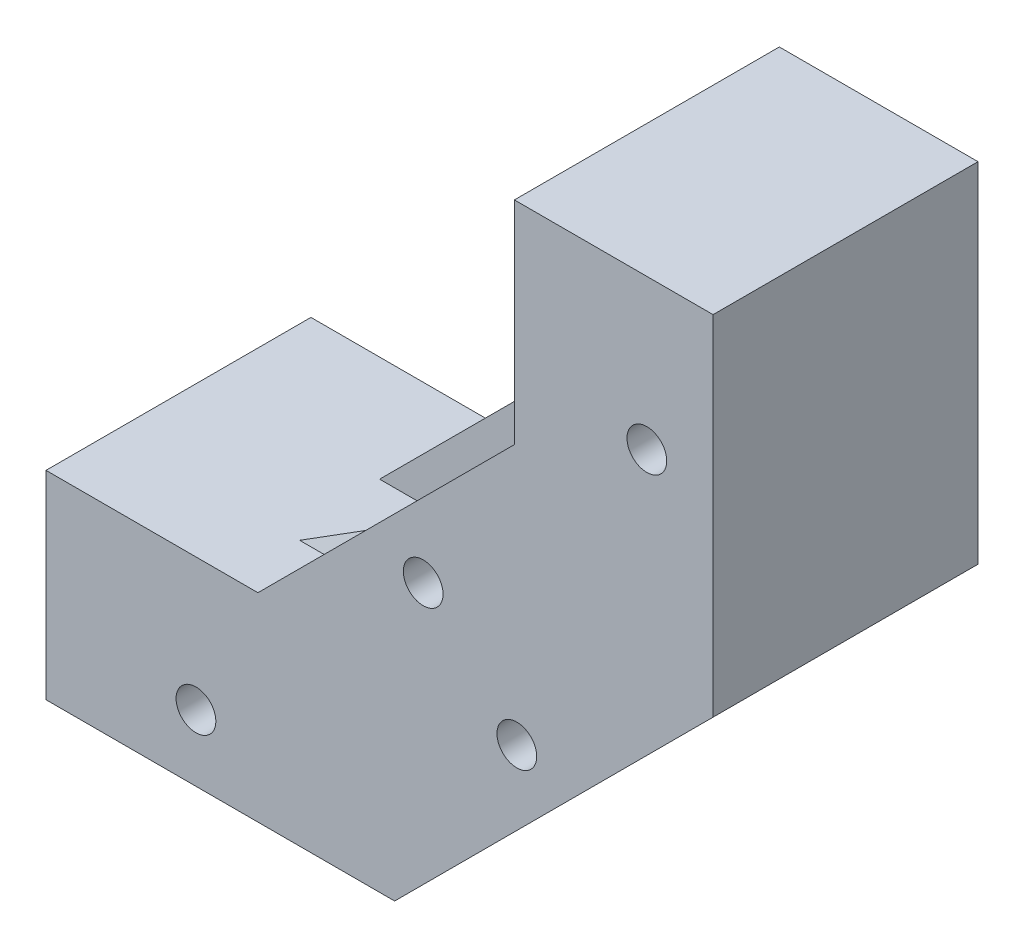
ISO-10303-21;
HEADER;
FILE_DESCRIPTION(('STEP AP214'),'2;1');
FILE_NAME('part.step','',(''),(''),'','','');
FILE_SCHEMA(('AUTOMOTIVE_DESIGN { 1 0 10303 214 1 1 1 1 }'));
ENDSEC;
DATA;
#1=APPLICATION_CONTEXT('core data for automotive mechanical design processes');
#2=APPLICATION_PROTOCOL_DEFINITION('international standard','automotive_design',2000,#1);
#3=PRODUCT_CONTEXT('',#1,'mechanical');
#4=PRODUCT('Part','Part','',(#3));
#5=PRODUCT_RELATED_PRODUCT_CATEGORY('part','',(#4));
#6=PRODUCT_DEFINITION_FORMATION('','',#4);
#7=PRODUCT_DEFINITION_CONTEXT('part definition',#1,'design');
#8=PRODUCT_DEFINITION('design','',#6,#7);
#9=PRODUCT_DEFINITION_SHAPE('','',#8);
#10=(LENGTH_UNIT() NAMED_UNIT(*) SI_UNIT(.MILLI.,.METRE.));
#11=(NAMED_UNIT(*) PLANE_ANGLE_UNIT() SI_UNIT($,.RADIAN.));
#12=(NAMED_UNIT(*) SI_UNIT($,.STERADIAN.) SOLID_ANGLE_UNIT());
#13=UNCERTAINTY_MEASURE_WITH_UNIT(LENGTH_MEASURE(1.E-05),#10,'distance_accuracy_value','');
#14=(GEOMETRIC_REPRESENTATION_CONTEXT(3) GLOBAL_UNCERTAINTY_ASSIGNED_CONTEXT((#13)) GLOBAL_UNIT_ASSIGNED_CONTEXT((#10,
#11,#12)) REPRESENTATION_CONTEXT('',''));
#15=CARTESIAN_POINT('',(0.,0.,0.));
#16=DIRECTION('',(0.,0.,1.));
#17=DIRECTION('',(1.,0.,0.));
#18=AXIS2_PLACEMENT_3D('',#15,#16,#17);
#19=CARTESIAN_POINT('',(114.678584629936,15.,0.));
#20=DIRECTION('',(-0.707106781186548,0.707106781186548,0.));
#21=DIRECTION('',(-0.707106781186548,-0.707106781186548,0.));
#22=AXIS2_PLACEMENT_3D('',#19,#20,#21);
#23=PLANE('',#22);
#24=DIRECTION('',(0.271964146610214,0.271964146610214,-0.923076923076921));
#25=VECTOR('',#24,1.);
#26=CARTESIAN_POINT('',(114.678584629936,15.,-8.13982140363869));
#27=LINE('',#26,#25);
#28=CARTESIAN_POINT('',(114.678584629936,15.,-8.1398214036387));
#29=VERTEX_POINT('',#28);
#30=CARTESIAN_POINT('',(115.820582400471,16.1419977705354,-12.0158903683372));
#31=VERTEX_POINT('',#30);
#32=EDGE_CURVE('E203',#29,#31,#27,.T.);
#33=ORIENTED_EDGE('',*,*,#32,.T.);
#34=DIRECTION('',(0.707106781186548,0.707106781186548,0.));
#35=VECTOR('',#34,1.);
#36=CARTESIAN_POINT('',(134.041630560343,34.3630459304069,-12.0158903683372));
#37=LINE('',#36,#35);
#38=CARTESIAN_POINT('',(114.678584629936,15.,-12.0158903683372));
#39=VERTEX_POINT('',#38);
#40=EDGE_CURVE('E474',#39,#31,#37,.T.);
#41=ORIENTED_EDGE('',*,*,#40,.F.);
#42=DIRECTION('',(0.,0.,1.));
#43=VECTOR('',#42,1.);
#44=CARTESIAN_POINT('',(114.678584629936,15.,0.));
#45=LINE('',#44,#43);
#46=EDGE_CURVE('E195',#39,#29,#45,.T.);
#47=ORIENTED_EDGE('',*,*,#46,.T.);
#48=EDGE_LOOP('',(#33,#41,#47));
#49=FACE_BOUND('',#48,.T.);
#50=ADVANCED_FACE('F41',(#49),#23,.T.);
#51=CARTESIAN_POINT('',(132.899632789807,33.2210481598714,-12.0158903683372));
#52=VERTEX_POINT('',#51);
#53=EDGE_CURVE('E473',#31,#52,#37,.T.);
#54=ORIENTED_EDGE('',*,*,#53,.F.);
#55=CARTESIAN_POINT('',(117.289039783274,17.6104551533379,-17.));
#56=VERTEX_POINT('',#55);
#57=EDGE_CURVE('E206',#31,#56,#27,.T.);
#58=ORIENTED_EDGE('',*,*,#57,.T.);
#59=DIRECTION('',(-0.707106781186548,-0.707106781186548,0.));
#60=VECTOR('',#59,1.);
#61=CARTESIAN_POINT('',(114.678584629936,15.,-17.));
#62=LINE('',#61,#60);
#63=CARTESIAN_POINT('',(131.431175407005,31.7525907770689,-17.));
#64=VERTEX_POINT('',#63);
#65=EDGE_CURVE('E200',#56,#64,#62,.F.);
#66=ORIENTED_EDGE('',*,*,#65,.T.);
#67=DIRECTION('',(0.271964146610213,0.271964146610212,0.923076923076922));
#68=VECTOR('',#67,1.);
#69=CARTESIAN_POINT('',(131.431175407005,31.7525907770689,-17.));
#70=LINE('',#69,#68);
#71=EDGE_CURVE('E197',#64,#52,#70,.T.);
#72=ORIENTED_EDGE('',*,*,#71,.T.);
#73=EDGE_LOOP('',(#54,#58,#66,#72));
#74=FACE_BOUND('',#73,.T.);
#75=ADVANCED_FACE('F526',(#74),#23,.F.);
#76=DIRECTION('',(0.,0.,1.));
#77=VECTOR('',#76,1.);
#78=CARTESIAN_POINT('',(134.041630560343,34.3630459304068,0.));
#79=LINE('',#78,#77);
#80=CARTESIAN_POINT('',(134.041630560343,34.363045930407,-12.0158903683372));
#81=VERTEX_POINT('',#80);
#82=CARTESIAN_POINT('',(134.041630560343,34.3630459304069,-8.13982140363858));
#83=VERTEX_POINT('',#82);
#84=EDGE_CURVE('E176',#81,#83,#79,.T.);
#85=ORIENTED_EDGE('',*,*,#84,.F.);
#86=EDGE_CURVE('E470',#52,#81,#37,.T.);
#87=ORIENTED_EDGE('',*,*,#86,.F.);
#88=EDGE_CURVE('E199',#52,#83,#70,.T.);
#89=ORIENTED_EDGE('',*,*,#88,.T.);
#90=EDGE_LOOP('',(#85,#87,#89));
#91=FACE_BOUND('',#90,.T.);
#92=ADVANCED_FACE('F523',(#91),#23,.T.);
#93=CARTESIAN_POINT('',(119.410360126833,19.7317754968976,-2.50000000000008));
#94=DIRECTION('',(0.707106781186547,-0.707106781186548,0.));
#95=DIRECTION('',(0.707106781186548,0.707106781186547,0.));
#96=AXIS2_PLACEMENT_3D('',#93,#94,#95);
#97=CYLINDRICAL_SURFACE('',#96,0.999999999999996);
#98=CARTESIAN_POINT('',(131.717514421272,7.42462120245879,-2.50000000000008));
#99=DIRECTION('',(-0.707106781186548,0.707106781186547,0.));
#100=DIRECTION('',(0.,0.,1.));
#101=AXIS2_PLACEMENT_3D('',#98,#99,#100);
#102=CIRCLE('',#101,1.);
#103=CARTESIAN_POINT('',(131.717514421272,7.42462120245879,-1.50000000000008));
#104=VERTEX_POINT('',#103);
#105=EDGE_CURVE('E367',#104,#104,#102,.T.);
#106=ORIENTED_EDGE('',*,*,#105,.F.);
#107=EDGE_LOOP('',(#106));
#108=FACE_BOUND('',#107,.T.);
#109=CARTESIAN_POINT('',(119.763913517427,19.3782221063045,-2.50000000000008));
#110=DIRECTION('',(0.707106781186548,-0.707106781186548,0.));
#111=DIRECTION('',(0.,0.,-1.));
#112=AXIS2_PLACEMENT_3D('',#109,#110,#111);
#113=CIRCLE('',#112,1.);
#114=CARTESIAN_POINT('',(119.763913517427,19.3782221063045,-3.50000000000008));
#115=VERTEX_POINT('',#114);
#116=EDGE_CURVE('E407',#115,#115,#113,.T.);
#117=ORIENTED_EDGE('',*,*,#116,.F.);
#118=EDGE_LOOP('',(#117));
#119=FACE_BOUND('',#118,.T.);
#120=ADVANCED_FACE('F525',(#108,#119),#97,.F.);
#121=CARTESIAN_POINT('',(129.309855063445,29.6312704335092,-2.49999999999992));
#122=DIRECTION('',(0.707106781186547,-0.707106781186548,0.));
#123=DIRECTION('',(0.707106781186548,0.707106781186547,0.));
#124=AXIS2_PLACEMENT_3D('',#121,#122,#123);
#125=CYLINDRICAL_SURFACE('',#124,1.00000000000001);
#126=CARTESIAN_POINT('',(141.617009357884,17.3241161390704,-2.49999999999992));
#127=DIRECTION('',(-0.707106781186548,0.707106781186547,0.));
#128=DIRECTION('',(0.,0.,1.));
#129=AXIS2_PLACEMENT_3D('',#126,#127,#128);
#130=CIRCLE('',#129,1.00000000000001);
#131=CARTESIAN_POINT('',(141.617009357884,17.3241161390704,-1.49999999999991));
#132=VERTEX_POINT('',#131);
#133=EDGE_CURVE('E341',#132,#132,#130,.T.);
#134=ORIENTED_EDGE('',*,*,#133,.F.);
#135=EDGE_LOOP('',(#134));
#136=FACE_BOUND('',#135,.T.);
#137=CARTESIAN_POINT('',(129.663408454038,29.2777170429157,-2.49999999999992));
#138=DIRECTION('',(0.707106781186548,-0.707106781186548,0.));
#139=DIRECTION('',(0.,0.,-1.));
#140=AXIS2_PLACEMENT_3D('',#137,#138,#139);
#141=CIRCLE('',#140,1.00000000000001);
#142=CARTESIAN_POINT('',(129.663408454038,29.2777170429157,-3.49999999999993));
#143=VERTEX_POINT('',#142);
#144=EDGE_CURVE('E370',#143,#143,#141,.T.);
#145=ORIENTED_EDGE('',*,*,#144,.F.);
#146=EDGE_LOOP('',(#145));
#147=FACE_BOUND('',#146,.T.);
#148=ADVANCED_FACE('F533',(#136,#147),#125,.F.);
#149=CARTESIAN_POINT('',(119.763913517427,19.3782221063043,-2.50000000000008));
#150=DIRECTION('',(0.707106781186548,-0.707106781186548,0.));
#151=DIRECTION('',(0.,0.,-1.));
#152=AXIS2_PLACEMENT_3D('',#149,#150,#151);
#153=TOROIDAL_SURFACE('',#152,1.5,0.5);
#154=ORIENTED_EDGE('',*,*,#116,.T.);
#155=EDGE_LOOP('',(#154));
#156=FACE_BOUND('',#155,.T.);
#157=CARTESIAN_POINT('',(119.410360126834,19.7317754968976,-2.50000000000008));
#158=DIRECTION('',(-0.707106781186548,0.707106781186548,0.));
#159=DIRECTION('',(-2.31296463463576E-13,-2.31296463463576E-13,1.));
#160=AXIS2_PLACEMENT_3D('',#157,#158,#159);
#161=CIRCLE('',#160,1.49999999999999);
#162=CARTESIAN_POINT('',(119.410360126833,19.7317754968972,-1.00000000000009));
#163=VERTEX_POINT('',#162);
#164=EDGE_CURVE('E304',#163,#163,#161,.F.);
#165=ORIENTED_EDGE('',*,*,#164,.F.);
#166=EDGE_LOOP('',(#165));
#167=FACE_BOUND('',#166,.T.);
#168=ADVANCED_FACE('F391',(#156,#167),#153,.T.);
#169=CARTESIAN_POINT('',(129.663408454038,29.2777170429159,-2.49999999999992));
#170=DIRECTION('',(0.707106781186548,-0.707106781186548,0.));
#171=DIRECTION('',(0.,0.,-1.));
#172=AXIS2_PLACEMENT_3D('',#169,#170,#171);
#173=TOROIDAL_SURFACE('',#172,1.50000000000001,0.5);
#174=ORIENTED_EDGE('',*,*,#144,.T.);
#175=EDGE_LOOP('',(#174));
#176=FACE_BOUND('',#175,.T.);
#177=CARTESIAN_POINT('',(129.309855063445,29.6312704335092,-2.49999999999992));
#178=DIRECTION('',(-0.707106781186548,0.707106781186548,0.));
#179=DIRECTION('',(1.11022302462514E-13,1.08709337827879E-13,1.));
#180=AXIS2_PLACEMENT_3D('',#177,#178,#179);
#181=CIRCLE('',#180,1.50000000000002);
#182=CARTESIAN_POINT('',(129.309855063445,29.6312704335093,-0.999999999999903));
#183=VERTEX_POINT('',#182);
#184=EDGE_CURVE('E299',#183,#183,#181,.F.);
#185=ORIENTED_EDGE('',*,*,#184,.F.);
#186=EDGE_LOOP('',(#185));
#187=FACE_BOUND('',#186,.T.);
#188=ADVANCED_FACE('F385',(#176,#187),#173,.T.);
#189=CARTESIAN_POINT('',(134.225995343588,14.8156352167546,0.));
#190=DIRECTION('',(0.,0.,-1.));
#191=DIRECTION('',(-1.,0.,0.));
#192=AXIS2_PLACEMENT_3D('',#189,#190,#191);
#193=CYLINDRICAL_SURFACE('',#192,1.5);
#194=CARTESIAN_POINT('',(134.225995343588,14.8156352167546,-5.));
#195=DIRECTION('',(0.,0.,-1.));
#196=DIRECTION('',(-1.,0.,0.));
#197=AXIS2_PLACEMENT_3D('',#194,#195,#196);
#198=CIRCLE('',#197,1.5);
#199=CARTESIAN_POINT('',(132.725995343588,14.8156352167546,-5.));
#200=VERTEX_POINT('',#199);
#201=EDGE_CURVE('E340',#200,#200,#198,.T.);
#202=ORIENTED_EDGE('',*,*,#201,.T.);
#203=EDGE_LOOP('',(#202));
#204=FACE_BOUND('',#203,.T.);
#205=CARTESIAN_POINT('',(134.225995343588,14.8156352167546,0.));
#206=DIRECTION('',(0.,0.,-1.));
#207=DIRECTION('',(-1.,0.,0.));
#208=AXIS2_PLACEMENT_3D('',#205,#206,#207);
#209=CIRCLE('',#208,1.5);
#210=CARTESIAN_POINT('',(132.725995343588,14.8156352167546,0.));
#211=VERTEX_POINT('',#210);
#212=EDGE_CURVE('E291',#211,#211,#209,.F.);
#213=ORIENTED_EDGE('',*,*,#212,.T.);
#214=EDGE_LOOP('',(#213));
#215=FACE_BOUND('',#214,.T.);
#216=ADVANCED_FACE('F390',(#204,#215),#193,.F.);
#217=CARTESIAN_POINT('',(127.154927531723,21.8867030286201,0.));
#218=DIRECTION('',(0.,0.,-1.));
#219=DIRECTION('',(-1.,0.,0.));
#220=AXIS2_PLACEMENT_3D('',#217,#218,#219);
#221=CYLINDRICAL_SURFACE('',#220,1.5);
#222=CARTESIAN_POINT('',(127.154927531723,21.8867030286201,-5.));
#223=DIRECTION('',(0.,0.,-1.));
#224=DIRECTION('',(-1.,0.,0.));
#225=AXIS2_PLACEMENT_3D('',#222,#223,#224);
#226=CIRCLE('',#225,1.5);
#227=CARTESIAN_POINT('',(125.654927531723,21.8867030286201,-5.));
#228=VERTEX_POINT('',#227);
#229=EDGE_CURVE('E337',#228,#228,#226,.T.);
#230=ORIENTED_EDGE('',*,*,#229,.T.);
#231=EDGE_LOOP('',(#230));
#232=FACE_BOUND('',#231,.T.);
#233=CARTESIAN_POINT('',(127.154927531723,21.8867030286201,0.));
#234=DIRECTION('',(0.,0.,-1.));
#235=DIRECTION('',(-1.,0.,0.));
#236=AXIS2_PLACEMENT_3D('',#233,#234,#235);
#237=CIRCLE('',#236,1.5);
#238=CARTESIAN_POINT('',(125.654927531723,21.8867030286201,0.));
#239=VERTEX_POINT('',#238);
#240=EDGE_CURVE('E288',#239,#239,#237,.F.);
#241=ORIENTED_EDGE('',*,*,#240,.T.);
#242=EDGE_LOOP('',(#241));
#243=FACE_BOUND('',#242,.T.);
#244=ADVANCED_FACE('F636',(#232,#243),#221,.F.);
#245=CARTESIAN_POINT('',(131.717514421272,7.42462120245879,-2.50000000000008));
#246=DIRECTION('',(-0.707106781186548,0.707106781186547,0.));
#247=DIRECTION('',(0.,0.,1.));
#248=AXIS2_PLACEMENT_3D('',#245,#246,#247);
#249=TOROIDAL_SURFACE('',#248,1.5,0.5);
#250=ORIENTED_EDGE('',*,*,#105,.T.);
#251=EDGE_LOOP('',(#250));
#252=FACE_BOUND('',#251,.T.);
#253=CARTESIAN_POINT('',(132.071067811865,7.07106781186551,-2.50000000000008));
#254=DIRECTION('',(0.707106781186548,-0.707106781186547,0.));
#255=DIRECTION('',(2.22044604925031E-13,2.24357569559667E-13,-1.));
#256=AXIS2_PLACEMENT_3D('',#253,#254,#255);
#257=CIRCLE('',#256,1.5);
#258=CARTESIAN_POINT('',(132.071067811866,7.07106781186584,-4.00000000000008));
#259=VERTEX_POINT('',#258);
#260=EDGE_CURVE('E238',#259,#259,#257,.F.);
#261=ORIENTED_EDGE('',*,*,#260,.F.);
#262=EDGE_LOOP('',(#261));
#263=FACE_BOUND('',#262,.T.);
#264=ADVANCED_FACE('F351',(#252,#263),#249,.T.);
#265=CARTESIAN_POINT('',(141.617009357884,17.3241161390704,-2.49999999999992));
#266=DIRECTION('',(-0.707106781186548,0.707106781186547,0.));
#267=DIRECTION('',(0.,0.,1.));
#268=AXIS2_PLACEMENT_3D('',#265,#266,#267);
#269=TOROIDAL_SURFACE('',#268,1.50000000000001,0.5);
#270=ORIENTED_EDGE('',*,*,#133,.T.);
#271=EDGE_LOOP('',(#270));
#272=FACE_BOUND('',#271,.T.);
#273=CARTESIAN_POINT('',(141.970562748477,16.9705627484771,-2.49999999999992));
#274=DIRECTION('',(0.707106781186548,-0.707106781186547,0.));
#275=DIRECTION('',(0.,0.,-1.));
#276=AXIS2_PLACEMENT_3D('',#273,#274,#275);
#277=CIRCLE('',#276,1.50000000000001);
#278=CARTESIAN_POINT('',(141.970562748477,16.970562748477,-3.99999999999993));
#279=VERTEX_POINT('',#278);
#280=EDGE_CURVE('E233',#279,#279,#277,.F.);
#281=ORIENTED_EDGE('',*,*,#280,.F.);
#282=EDGE_LOOP('',(#281));
#283=FACE_BOUND('',#282,.T.);
#284=ADVANCED_FACE('F346',(#272,#283),#269,.T.);
#285=CARTESIAN_POINT('',(129.949747468306,4.94974746830585,-17.));
#286=DIRECTION('',(-0.652713951864506,-0.652713951864505,-0.384615384615385));
#287=DIRECTION('',(0.707106781186547,-0.707106781186548,0.));
#288=AXIS2_PLACEMENT_3D('',#285,#286,#287);
#289=PLANE('',#288);
#290=DIRECTION('',(0.70710678118655,-0.707106781186545,0.));
#291=VECTOR('',#290,1.);
#292=CARTESIAN_POINT('',(112.828427124746,15.,-4.99999999999997));
#293=LINE('',#292,#291);
#294=CARTESIAN_POINT('',(112.828427124746,15.0000000000001,-4.99999999999995));
#295=VERTEX_POINT('',#294);
#296=CARTESIAN_POINT('',(126.414213562373,1.41421356237303,-4.99999999999996));
#297=VERTEX_POINT('',#296);
#298=EDGE_CURVE('E338',#295,#297,#293,.T.);
#299=ORIENTED_EDGE('',*,*,#298,.T.);
#300=DIRECTION('',(-0.271964146610217,-0.271964146610218,0.923076923076919));
#301=VECTOR('',#300,1.);
#302=CARTESIAN_POINT('',(129.949747468306,4.9497474683057,-17.));
#303=LINE('',#302,#301);
#304=CARTESIAN_POINT('',(129.949747468306,4.94974746830581,-17.));
#305=VERTEX_POINT('',#304);
#306=EDGE_CURVE('E278',#305,#297,#303,.T.);
#307=ORIENTED_EDGE('',*,*,#306,.F.);
#308=DIRECTION('',(-0.707106781186545,0.70710678118655,0.));
#309=VECTOR('',#308,1.);
#310=CARTESIAN_POINT('',(129.949747468306,4.94974746830585,-17.));
#311=LINE('',#310,#309);
#312=EDGE_CURVE('E292',#305,#56,#311,.T.);
#313=ORIENTED_EDGE('',*,*,#312,.T.);
#314=ORIENTED_EDGE('',*,*,#57,.F.);
#315=ORIENTED_EDGE('',*,*,#32,.F.);
#316=DIRECTION('',(0.507673082566878,0.,-0.861549790341245));
#317=VECTOR('',#316,1.);
#318=CARTESIAN_POINT('',(112.828427124746,15.,-4.99999999999997));
#319=LINE('',#318,#317);
#320=EDGE_CURVE('E219',#295,#29,#319,.T.);
#321=ORIENTED_EDGE('',*,*,#320,.F.);
#322=EDGE_LOOP('',(#299,#307,#313,#314,#315,#321));
#323=FACE_BOUND('',#322,.T.);
#324=ADVANCED_FACE('F350',(#323),#289,.F.);
#325=CARTESIAN_POINT('',(126.414213562373,1.4142135623731,-5.));
#326=DIRECTION('',(0.,0.,1.));
#327=DIRECTION('',(1.,0.,0.));
#328=AXIS2_PLACEMENT_3D('',#325,#326,#327);
#329=PLANE('',#328);
#330=ORIENTED_EDGE('',*,*,#229,.F.);
#331=EDGE_LOOP('',(#330));
#332=FACE_BOUND('',#331,.T.);
#333=ORIENTED_EDGE('',*,*,#201,.F.);
#334=EDGE_LOOP('',(#333));
#335=FACE_BOUND('',#334,.T.);
#336=DIRECTION('',(-0.707106781186548,-0.707106781186548,0.));
#337=VECTOR('',#336,1.);
#338=CARTESIAN_POINT('',(114.678584629936,15.,-4.99999999999998));
#339=LINE('',#338,#337);
#340=CARTESIAN_POINT('',(134.041630560343,34.3630459304068,-4.99999999999998));
#341=VERTEX_POINT('',#340);
#342=CARTESIAN_POINT('',(114.678584629936,15.,-4.99999999999998));
#343=VERTEX_POINT('',#342);
#344=EDGE_CURVE('E330',#341,#343,#339,.T.);
#345=ORIENTED_EDGE('',*,*,#344,.F.);
#346=DIRECTION('',(0.,-1.,0.));
#347=VECTOR('',#346,1.);
#348=CARTESIAN_POINT('',(134.041630560343,34.3630459304068,-4.99999999999997));
#349=LINE('',#348,#347);
#350=CARTESIAN_POINT('',(134.041630560343,36.2132034355964,-4.99999999999998));
#351=VERTEX_POINT('',#350);
#352=EDGE_CURVE('E193',#351,#341,#349,.T.);
#353=ORIENTED_EDGE('',*,*,#352,.F.);
#354=DIRECTION('',(-0.707106781186548,0.707106781186547,0.));
#355=VECTOR('',#354,1.);
#356=CARTESIAN_POINT('',(147.62741699797,22.6274169979695,-4.99999999999999));
#357=LINE('',#356,#355);
#358=CARTESIAN_POINT('',(147.62741699797,22.6274169979695,-5.));
#359=VERTEX_POINT('',#358);
#360=EDGE_CURVE('E297',#351,#359,#357,.F.);
#361=ORIENTED_EDGE('',*,*,#360,.T.);
#362=DIRECTION('',(0.707106781186547,0.707106781186548,0.));
#363=VECTOR('',#362,1.);
#364=CARTESIAN_POINT('',(149.041630560343,24.0416305603426,-4.99999999999999));
#365=LINE('',#364,#363);
#366=EDGE_CURVE('E275',#297,#359,#365,.T.);
#367=ORIENTED_EDGE('',*,*,#366,.F.);
#368=ORIENTED_EDGE('',*,*,#298,.F.);
#369=DIRECTION('',(-1.,0.,0.));
#370=VECTOR('',#369,1.);
#371=CARTESIAN_POINT('',(98.6785846299358,15.,-4.99999999999997));
#372=LINE('',#371,#370);
#373=EDGE_CURVE('E207',#343,#295,#372,.T.);
#374=ORIENTED_EDGE('',*,*,#373,.F.);
#375=EDGE_LOOP('',(#345,#353,#361,#367,#368,#374));
#376=FACE_BOUND('',#375,.T.);
#377=ADVANCED_FACE('F322',(#332,#335,#376),#329,.F.);
#378=CARTESIAN_POINT('',(114.678584629936,15.,0.));
#379=DIRECTION('',(-0.707106781186548,0.707106781186548,0.));
#380=DIRECTION('',(-0.707106781186548,-0.707106781186548,0.));
#381=AXIS2_PLACEMENT_3D('',#378,#379,#380);
#382=PLANE('',#381);
#383=ORIENTED_EDGE('',*,*,#184,.T.);
#384=EDGE_LOOP('',(#383));
#385=FACE_BOUND('',#384,.T.);
#386=ORIENTED_EDGE('',*,*,#164,.T.);
#387=EDGE_LOOP('',(#386));
#388=FACE_BOUND('',#387,.T.);
#389=DIRECTION('',(0.707106781186551,0.707106781186544,0.));
#390=VECTOR('',#389,1.);
#391=CARTESIAN_POINT('',(114.678584629936,15.,0.));
#392=LINE('',#391,#390);
#393=CARTESIAN_POINT('',(114.678584629936,15.,0.));
#394=VERTEX_POINT('',#393);
#395=CARTESIAN_POINT('',(134.041630560343,34.3630459304068,0.));
#396=VERTEX_POINT('',#395);
#397=EDGE_CURVE('E289',#394,#396,#392,.T.);
#398=ORIENTED_EDGE('',*,*,#397,.T.);
#399=DIRECTION('',(0.,0.,1.));
#400=VECTOR('',#399,1.);
#401=CARTESIAN_POINT('',(134.041630560343,34.3630459304068,0.));
#402=LINE('',#401,#400);
#403=EDGE_CURVE('E175',#341,#396,#402,.T.);
#404=ORIENTED_EDGE('',*,*,#403,.F.);
#405=ORIENTED_EDGE('',*,*,#344,.T.);
#406=DIRECTION('',(0.,0.,1.));
#407=VECTOR('',#406,1.);
#408=CARTESIAN_POINT('',(114.678584629936,15.,0.));
#409=LINE('',#408,#407);
#410=EDGE_CURVE('E210',#394,#343,#409,.F.);
#411=ORIENTED_EDGE('',*,*,#410,.F.);
#412=EDGE_LOOP('',(#398,#404,#405,#411));
#413=FACE_BOUND('',#412,.T.);
#414=ADVANCED_FACE('F311',(#385,#388,#413),#382,.T.);
#415=CARTESIAN_POINT('',(147.62741699797,22.6274169979695,-5.));
#416=DIRECTION('',(0.652713951864505,0.652713951864506,-0.384615384615385));
#417=DIRECTION('',(-0.707106781186548,0.707106781186547,0.));
#418=AXIS2_PLACEMENT_3D('',#415,#416,#417);
#419=PLANE('',#418);
#420=DIRECTION('',(0.707106781186544,-0.70710678118655,0.));
#421=VECTOR('',#420,1.);
#422=CARTESIAN_POINT('',(131.431175407005,31.7525907770689,-17.));
#423=LINE('',#422,#421);
#424=CARTESIAN_POINT('',(144.091883092037,19.0918830920367,-17.));
#425=VERTEX_POINT('',#424);
#426=EDGE_CURVE('E295',#64,#425,#423,.T.);
#427=ORIENTED_EDGE('',*,*,#426,.T.);
#428=DIRECTION('',(-0.271964146610217,-0.271964146610218,-0.923076923076919));
#429=VECTOR('',#428,1.);
#430=CARTESIAN_POINT('',(147.62741699797,22.6274169979695,-5.));
#431=LINE('',#430,#429);
#432=EDGE_CURVE('E272',#359,#425,#431,.T.);
#433=ORIENTED_EDGE('',*,*,#432,.F.);
#434=ORIENTED_EDGE('',*,*,#360,.F.);
#435=DIRECTION('',(0.,0.507673082566804,0.861549790341289));
#436=VECTOR('',#435,1.);
#437=CARTESIAN_POINT('',(134.041630560343,34.3630459304068,-8.13982140363861));
#438=LINE('',#437,#436);
#439=EDGE_CURVE('E168',#83,#351,#438,.T.);
#440=ORIENTED_EDGE('',*,*,#439,.F.);
#441=ORIENTED_EDGE('',*,*,#88,.F.);
#442=ORIENTED_EDGE('',*,*,#71,.F.);
#443=EDGE_LOOP('',(#427,#433,#434,#440,#441,#442));
#444=FACE_BOUND('',#443,.T.);
#445=ADVANCED_FACE('F321',(#444),#419,.F.);
#446=CARTESIAN_POINT('',(144.091883092037,19.0918830920368,-17.));
#447=DIRECTION('',(0.,0.,-1.));
#448=DIRECTION('',(-1.,0.,0.));
#449=AXIS2_PLACEMENT_3D('',#446,#447,#448);
#450=PLANE('',#449);
#451=CARTESIAN_POINT('',(127.154927531723,21.8867030286201,-17.));
#452=DIRECTION('',(0.,0.,-1.));
#453=DIRECTION('',(-1.,0.,0.));
#454=AXIS2_PLACEMENT_3D('',#451,#452,#453);
#455=CIRCLE('',#454,1.5);
#456=CARTESIAN_POINT('',(125.654927531723,21.8867030286201,-17.));
#457=VERTEX_POINT('',#456);
#458=EDGE_CURVE('E184',#457,#457,#455,.T.);
#459=ORIENTED_EDGE('',*,*,#458,.T.);
#460=EDGE_LOOP('',(#459));
#461=FACE_BOUND('',#460,.T.);
#462=CARTESIAN_POINT('',(134.225995343588,14.8156352167546,-17.));
#463=DIRECTION('',(0.,0.,-1.));
#464=DIRECTION('',(-1.,0.,0.));
#465=AXIS2_PLACEMENT_3D('',#462,#463,#464);
#466=CIRCLE('',#465,1.5);
#467=CARTESIAN_POINT('',(132.725995343588,14.8156352167546,-17.));
#468=VERTEX_POINT('',#467);
#469=EDGE_CURVE('E181',#468,#468,#466,.T.);
#470=ORIENTED_EDGE('',*,*,#469,.T.);
#471=EDGE_LOOP('',(#470));
#472=FACE_BOUND('',#471,.T.);
#473=ORIENTED_EDGE('',*,*,#312,.F.);
#474=DIRECTION('',(0.707106781186547,0.707106781186548,0.));
#475=VECTOR('',#474,1.);
#476=CARTESIAN_POINT('',(149.041630560343,24.0416305603426,-17.));
#477=LINE('',#476,#475);
#478=EDGE_CURVE('E264',#425,#305,#477,.F.);
#479=ORIENTED_EDGE('',*,*,#478,.F.);
#480=ORIENTED_EDGE('',*,*,#426,.F.);
#481=ORIENTED_EDGE('',*,*,#65,.F.);
#482=EDGE_LOOP('',(#473,#479,#480,#481));
#483=FACE_BOUND('',#482,.T.);
#484=ADVANCED_FACE('F621',(#461,#472,#483),#450,.F.);
#485=CARTESIAN_POINT('',(123.860107595139,25.1815229652034,0.));
#486=DIRECTION('',(0.,0.,-1.));
#487=DIRECTION('',(-1.,0.,0.));
#488=AXIS2_PLACEMENT_3D('',#485,#486,#487);
#489=PLANE('',#488);
#490=CARTESIAN_POINT('',(109.999999776483,5.00000007450576,0.));
#491=DIRECTION('',(0.,0.,-1.));
#492=DIRECTION('',(-1.,0.,0.));
#493=AXIS2_PLACEMENT_3D('',#490,#491,#492);
#494=CIRCLE('',#493,1.5);
#495=CARTESIAN_POINT('',(108.499999776483,5.00000007450576,0.));
#496=VERTEX_POINT('',#495);
#497=EDGE_CURVE('E416',#496,#496,#494,.T.);
#498=ORIENTED_EDGE('',*,*,#497,.T.);
#499=EDGE_LOOP('',(#498));
#500=FACE_BOUND('',#499,.T.);
#501=CARTESIAN_POINT('',(144.041630485837,39.0416307838601,0.));
#502=DIRECTION('',(0.,0.,-1.));
#503=DIRECTION('',(-1.,0.,0.));
#504=AXIS2_PLACEMENT_3D('',#501,#502,#503);
#505=CIRCLE('',#504,1.5);
#506=CARTESIAN_POINT('',(142.541630485837,39.0416307838601,0.));
#507=VERTEX_POINT('',#506);
#508=EDGE_CURVE('E425',#507,#507,#505,.T.);
#509=ORIENTED_EDGE('',*,*,#508,.T.);
#510=EDGE_LOOP('',(#509));
#511=FACE_BOUND('',#510,.T.);
#512=ORIENTED_EDGE('',*,*,#240,.F.);
#513=EDGE_LOOP('',(#512));
#514=FACE_BOUND('',#513,.T.);
#515=ORIENTED_EDGE('',*,*,#212,.F.);
#516=EDGE_LOOP('',(#515));
#517=FACE_BOUND('',#516,.T.);
#518=DIRECTION('',(-1.,0.,0.));
#519=VECTOR('',#518,1.);
#520=CARTESIAN_POINT('',(134.041630560343,50.3630459304068,0.));
#521=LINE('',#520,#519);
#522=CARTESIAN_POINT('',(134.041630560343,50.3630459304068,0.));
#523=VERTEX_POINT('',#522);
#524=CARTESIAN_POINT('',(149.041630560343,50.3630459304068,0.));
#525=VERTEX_POINT('',#524);
#526=EDGE_CURVE('E156',#523,#525,#521,.F.);
#527=ORIENTED_EDGE('',*,*,#526,.F.);
#528=DIRECTION('',(0.,-1.,0.));
#529=VECTOR('',#528,1.);
#530=CARTESIAN_POINT('',(134.041630560343,34.3630459304068,0.));
#531=LINE('',#530,#529);
#532=EDGE_CURVE('E159',#396,#523,#531,.F.);
#533=ORIENTED_EDGE('',*,*,#532,.F.);
#534=ORIENTED_EDGE('',*,*,#397,.F.);
#535=DIRECTION('',(-1.,0.,0.));
#536=VECTOR('',#535,1.);
#537=CARTESIAN_POINT('',(98.6785846299358,15.,0.));
#538=LINE('',#537,#536);
#539=CARTESIAN_POINT('',(98.6785846299358,15.,0.));
#540=VERTEX_POINT('',#539);
#541=EDGE_CURVE('E213',#540,#394,#538,.F.);
#542=ORIENTED_EDGE('',*,*,#541,.F.);
#543=DIRECTION('',(0.,-1.,0.));
#544=VECTOR('',#543,1.);
#545=CARTESIAN_POINT('',(98.6785846299358,0.,0.));
#546=LINE('',#545,#544);
#547=CARTESIAN_POINT('',(98.6785846299358,0.,0.));
#548=VERTEX_POINT('',#547);
#549=EDGE_CURVE('E225',#548,#540,#546,.F.);
#550=ORIENTED_EDGE('',*,*,#549,.F.);
#551=DIRECTION('',(1.,0.,0.));
#552=VECTOR('',#551,1.);
#553=CARTESIAN_POINT('',(125.,0.,0.));
#554=LINE('',#553,#552);
#555=CARTESIAN_POINT('',(125.,0.,0.));
#556=VERTEX_POINT('',#555);
#557=EDGE_CURVE('E230',#556,#548,#554,.F.);
#558=ORIENTED_EDGE('',*,*,#557,.F.);
#559=DIRECTION('',(0.707106781186547,0.707106781186548,0.));
#560=VECTOR('',#559,1.);
#561=CARTESIAN_POINT('',(149.041630560343,24.0416305603426,0.));
#562=LINE('',#561,#560);
#563=CARTESIAN_POINT('',(149.041630560343,24.0416305603426,0.));
#564=VERTEX_POINT('',#563);
#565=EDGE_CURVE('E284',#564,#556,#562,.F.);
#566=ORIENTED_EDGE('',*,*,#565,.F.);
#567=DIRECTION('',(0.,1.,0.));
#568=VECTOR('',#567,1.);
#569=CARTESIAN_POINT('',(149.041630560343,50.3630459304068,0.));
#570=LINE('',#569,#568);
#571=EDGE_CURVE('E162',#525,#564,#570,.F.);
#572=ORIENTED_EDGE('',*,*,#571,.F.);
#573=EDGE_LOOP('',(#527,#533,#534,#542,#550,#558,#566,#572));
#574=FACE_BOUND('',#573,.T.);
#575=ADVANCED_FACE('F158',(#500,#511,#514,#517,#574),#489,.F.);
#576=CARTESIAN_POINT('',(149.041630560343,50.3630459304068,0.));
#577=DIRECTION('',(1.,0.,0.));
#578=DIRECTION('',(0.,1.,0.));
#579=AXIS2_PLACEMENT_3D('',#576,#577,#578);
#580=PLANE('',#579);
#581=DIRECTION('',(0.,1.,0.));
#582=VECTOR('',#581,1.);
#583=CARTESIAN_POINT('',(149.041630560343,25.1815229652034,-20.));
#584=LINE('',#583,#582);
#585=CARTESIAN_POINT('',(149.041630560343,50.3630459304068,-20.));
#586=VERTEX_POINT('',#585);
#587=CARTESIAN_POINT('',(149.041630560343,24.0416305603426,-20.));
#588=VERTEX_POINT('',#587);
#589=EDGE_CURVE('E424',#586,#588,#584,.F.);
#590=ORIENTED_EDGE('',*,*,#589,.F.);
#591=DIRECTION('',(0.,0.,1.));
#592=VECTOR('',#591,1.);
#593=CARTESIAN_POINT('',(149.041630560343,50.3630459304068,0.));
#594=LINE('',#593,#592);
#595=EDGE_CURVE('E167',#525,#586,#594,.F.);
#596=ORIENTED_EDGE('',*,*,#595,.F.);
#597=ORIENTED_EDGE('',*,*,#571,.T.);
#598=DIRECTION('',(0.,0.,1.));
#599=VECTOR('',#598,1.);
#600=CARTESIAN_POINT('',(149.041630560343,24.0416305603426,0.));
#601=LINE('',#600,#599);
#602=EDGE_CURVE('E281',#588,#564,#601,.T.);
#603=ORIENTED_EDGE('',*,*,#602,.F.);
#604=EDGE_LOOP('',(#590,#596,#597,#603));
#605=FACE_BOUND('',#604,.T.);
#606=ADVANCED_FACE('F256',(#605),#580,.T.);
#607=CARTESIAN_POINT('',(149.041630560343,24.0416305603426,0.));
#608=DIRECTION('',(0.707106781186548,-0.707106781186547,0.));
#609=DIRECTION('',(0.707106781186547,0.707106781186548,0.));
#610=AXIS2_PLACEMENT_3D('',#607,#608,#609);
#611=PLANE('',#610);
#612=ORIENTED_EDGE('',*,*,#280,.T.);
#613=EDGE_LOOP('',(#612));
#614=FACE_BOUND('',#613,.T.);
#615=ORIENTED_EDGE('',*,*,#432,.T.);
#616=ORIENTED_EDGE('',*,*,#478,.T.);
#617=ORIENTED_EDGE('',*,*,#306,.T.);
#618=ORIENTED_EDGE('',*,*,#366,.T.);
#619=EDGE_LOOP('',(#615,#616,#617,#618));
#620=FACE_BOUND('',#619,.T.);
#621=ORIENTED_EDGE('',*,*,#260,.T.);
#622=EDGE_LOOP('',(#621));
#623=FACE_BOUND('',#622,.T.);
#624=DIRECTION('',(-0.707106781186553,-0.707106781186542,0.));
#625=VECTOR('',#624,1.);
#626=CARTESIAN_POINT('',(149.041630560343,24.0416305603426,-20.));
#627=LINE('',#626,#625);
#628=CARTESIAN_POINT('',(125.,0.,-20.));
#629=VERTEX_POINT('',#628);
#630=EDGE_CURVE('E460',#588,#629,#627,.T.);
#631=ORIENTED_EDGE('',*,*,#630,.F.);
#632=ORIENTED_EDGE('',*,*,#602,.T.);
#633=ORIENTED_EDGE('',*,*,#565,.T.);
#634=DIRECTION('',(0.,0.,-1.));
#635=VECTOR('',#634,1.);
#636=CARTESIAN_POINT('',(125.,0.,0.));
#637=LINE('',#636,#635);
#638=EDGE_CURVE('E227',#629,#556,#637,.F.);
#639=ORIENTED_EDGE('',*,*,#638,.F.);
#640=EDGE_LOOP('',(#631,#632,#633,#639));
#641=FACE_BOUND('',#640,.T.);
#642=ADVANCED_FACE('F245',(#614,#620,#623,#641),#611,.T.);
#643=CARTESIAN_POINT('',(125.,0.,0.));
#644=DIRECTION('',(0.,-1.,0.));
#645=DIRECTION('',(0.,0.,-1.));
#646=AXIS2_PLACEMENT_3D('',#643,#644,#645);
#647=PLANE('',#646);
#648=DIRECTION('',(-1.,0.,0.));
#649=VECTOR('',#648,1.);
#650=CARTESIAN_POINT('',(123.860107595139,0.,-20.));
#651=LINE('',#650,#649);
#652=CARTESIAN_POINT('',(98.6785846299358,0.,-20.));
#653=VERTEX_POINT('',#652);
#654=EDGE_CURVE('E457',#629,#653,#651,.T.);
#655=ORIENTED_EDGE('',*,*,#654,.F.);
#656=ORIENTED_EDGE('',*,*,#638,.T.);
#657=ORIENTED_EDGE('',*,*,#557,.T.);
#658=DIRECTION('',(0.,0.,1.));
#659=VECTOR('',#658,1.);
#660=CARTESIAN_POINT('',(98.6785846299358,0.,0.));
#661=LINE('',#660,#659);
#662=EDGE_CURVE('E222',#653,#548,#661,.T.);
#663=ORIENTED_EDGE('',*,*,#662,.F.);
#664=EDGE_LOOP('',(#655,#656,#657,#663));
#665=FACE_BOUND('',#664,.T.);
#666=ADVANCED_FACE('F255',(#665),#647,.T.);
#667=CARTESIAN_POINT('',(98.6785846299358,0.,0.));
#668=DIRECTION('',(-1.,0.,0.));
#669=DIRECTION('',(0.,-1.,0.));
#670=AXIS2_PLACEMENT_3D('',#667,#668,#669);
#671=PLANE('',#670);
#672=DIRECTION('',(0.,1.,0.));
#673=VECTOR('',#672,1.);
#674=CARTESIAN_POINT('',(98.6785846299358,25.1815229652034,-20.));
#675=LINE('',#674,#673);
#676=CARTESIAN_POINT('',(98.6785846299358,15.,-20.));
#677=VERTEX_POINT('',#676);
#678=EDGE_CURVE('E454',#653,#677,#675,.T.);
#679=ORIENTED_EDGE('',*,*,#678,.F.);
#680=ORIENTED_EDGE('',*,*,#662,.T.);
#681=ORIENTED_EDGE('',*,*,#549,.T.);
#682=DIRECTION('',(0.,0.,1.));
#683=VECTOR('',#682,1.);
#684=CARTESIAN_POINT('',(98.6785846299358,15.,0.));
#685=LINE('',#684,#683);
#686=EDGE_CURVE('E216',#677,#540,#685,.T.);
#687=ORIENTED_EDGE('',*,*,#686,.F.);
#688=EDGE_LOOP('',(#679,#680,#681,#687));
#689=FACE_BOUND('',#688,.T.);
#690=ADVANCED_FACE('F504',(#689),#671,.T.);
#691=CARTESIAN_POINT('',(98.6785846299358,15.,0.));
#692=DIRECTION('',(0.,1.,0.));
#693=DIRECTION('',(-1.,0.,0.));
#694=AXIS2_PLACEMENT_3D('',#691,#692,#693);
#695=PLANE('',#694);
#696=DIRECTION('',(0.,0.,-1.));
#697=VECTOR('',#696,1.);
#698=CARTESIAN_POINT('',(111.85015750519,15.,5.));
#699=LINE('',#698,#697);
#700=CARTESIAN_POINT('',(111.85015750519,15.,-12.0158903683372));
#701=VERTEX_POINT('',#700);
#702=CARTESIAN_POINT('',(111.85015750519,15.,-20.));
#703=VERTEX_POINT('',#702);
#704=EDGE_CURVE('E477',#701,#703,#699,.T.);
#705=ORIENTED_EDGE('',*,*,#704,.T.);
#706=DIRECTION('',(-1.,0.,0.));
#707=VECTOR('',#706,1.);
#708=CARTESIAN_POINT('',(123.860107595139,15.,-20.));
#709=LINE('',#708,#707);
#710=EDGE_CURVE('E452',#677,#703,#709,.F.);
#711=ORIENTED_EDGE('',*,*,#710,.F.);
#712=ORIENTED_EDGE('',*,*,#686,.T.);
#713=ORIENTED_EDGE('',*,*,#541,.T.);
#714=ORIENTED_EDGE('',*,*,#410,.T.);
#715=ORIENTED_EDGE('',*,*,#373,.T.);
#716=ORIENTED_EDGE('',*,*,#320,.T.);
#717=ORIENTED_EDGE('',*,*,#46,.F.);
#718=DIRECTION('',(-1.,0.,0.));
#719=VECTOR('',#718,1.);
#720=CARTESIAN_POINT('',(98.6785846299358,15.,-12.0158903683372));
#721=LINE('',#720,#719);
#722=EDGE_CURVE('E441',#39,#701,#721,.T.);
#723=ORIENTED_EDGE('',*,*,#722,.T.);
#724=EDGE_LOOP('',(#705,#711,#712,#713,#714,#715,#716,#717,#723));
#725=FACE_BOUND('',#724,.T.);
#726=ADVANCED_FACE('F501',(#725),#695,.T.);
#727=CARTESIAN_POINT('',(134.041630560343,34.3630459304068,0.));
#728=DIRECTION('',(-1.,0.,0.));
#729=DIRECTION('',(0.,-1.,0.));
#730=AXIS2_PLACEMENT_3D('',#727,#728,#729);
#731=PLANE('',#730);
#732=DIRECTION('',(0.,1.,0.));
#733=VECTOR('',#732,1.);
#734=CARTESIAN_POINT('',(134.041630560343,25.1815229652034,-20.));
#735=LINE('',#734,#733);
#736=CARTESIAN_POINT('',(134.041630560343,37.1914730551532,-20.));
#737=VERTEX_POINT('',#736);
#738=CARTESIAN_POINT('',(134.041630560343,50.3630459304068,-20.));
#739=VERTEX_POINT('',#738);
#740=EDGE_CURVE('E56',#737,#739,#735,.T.);
#741=ORIENTED_EDGE('',*,*,#740,.F.);
#742=DIRECTION('',(0.,0.,-1.));
#743=VECTOR('',#742,1.);
#744=CARTESIAN_POINT('',(134.041630560343,37.1914730551532,0.));
#745=LINE('',#744,#743);
#746=CARTESIAN_POINT('',(134.041630560343,37.1914730551532,-12.0158903683372));
#747=VERTEX_POINT('',#746);
#748=EDGE_CURVE('E12',#747,#737,#745,.T.);
#749=ORIENTED_EDGE('',*,*,#748,.F.);
#750=DIRECTION('',(0.,1.,0.));
#751=VECTOR('',#750,1.);
#752=CARTESIAN_POINT('',(134.041630560343,35.77725949278,-12.0158903683372));
#753=LINE('',#752,#751);
#754=EDGE_CURVE('E49',#81,#747,#753,.T.);
#755=ORIENTED_EDGE('',*,*,#754,.F.);
#756=ORIENTED_EDGE('',*,*,#84,.T.);
#757=ORIENTED_EDGE('',*,*,#439,.T.);
#758=ORIENTED_EDGE('',*,*,#352,.T.);
#759=ORIENTED_EDGE('',*,*,#403,.T.);
#760=ORIENTED_EDGE('',*,*,#532,.T.);
#761=DIRECTION('',(0.,0.,1.));
#762=VECTOR('',#761,1.);
#763=CARTESIAN_POINT('',(134.041630560343,50.3630459304068,0.));
#764=LINE('',#763,#762);
#765=EDGE_CURVE('E171',#739,#523,#764,.T.);
#766=ORIENTED_EDGE('',*,*,#765,.F.);
#767=EDGE_LOOP('',(#741,#749,#755,#756,#757,#758,#759,#760,#766));
#768=FACE_BOUND('',#767,.T.);
#769=ADVANCED_FACE('F170',(#768),#731,.T.);
#770=CARTESIAN_POINT('',(134.041630560343,50.3630459304068,0.));
#771=DIRECTION('',(0.,1.,0.));
#772=DIRECTION('',(-1.,0.,0.));
#773=AXIS2_PLACEMENT_3D('',#770,#771,#772);
#774=PLANE('',#773);
#775=DIRECTION('',(-1.,0.,0.));
#776=VECTOR('',#775,1.);
#777=CARTESIAN_POINT('',(123.860107595139,50.3630459304068,-20.));
#778=LINE('',#777,#776);
#779=EDGE_CURVE('E180',#739,#586,#778,.F.);
#780=ORIENTED_EDGE('',*,*,#779,.F.);
#781=ORIENTED_EDGE('',*,*,#765,.T.);
#782=ORIENTED_EDGE('',*,*,#526,.T.);
#783=ORIENTED_EDGE('',*,*,#595,.T.);
#784=EDGE_LOOP('',(#780,#781,#782,#783));
#785=FACE_BOUND('',#784,.T.);
#786=ADVANCED_FACE('F178',(#785),#774,.T.);
#787=CARTESIAN_POINT('',(134.225995343588,14.8156352167546,0.));
#788=DIRECTION('',(0.,0.,-1.));
#789=DIRECTION('',(-1.,0.,0.));
#790=AXIS2_PLACEMENT_3D('',#787,#788,#789);
#791=CYLINDRICAL_SURFACE('',#790,1.5);
#792=CARTESIAN_POINT('',(134.225995343588,14.8156352167546,-20.));
#793=DIRECTION('',(0.,0.,-1.));
#794=DIRECTION('',(-1.,0.,0.));
#795=AXIS2_PLACEMENT_3D('',#792,#793,#794);
#796=CIRCLE('',#795,1.5);
#797=CARTESIAN_POINT('',(132.725995343588,14.8156352167546,-20.));
#798=VERTEX_POINT('',#797);
#799=EDGE_CURVE('E448',#798,#798,#796,.F.);
#800=ORIENTED_EDGE('',*,*,#799,.F.);
#801=EDGE_LOOP('',(#800));
#802=FACE_BOUND('',#801,.T.);
#803=ORIENTED_EDGE('',*,*,#469,.F.);
#804=EDGE_LOOP('',(#803));
#805=FACE_BOUND('',#804,.T.);
#806=ADVANCED_FACE('F729',(#802,#805),#791,.F.);
#807=CARTESIAN_POINT('',(127.154927531723,21.8867030286201,0.));
#808=DIRECTION('',(0.,0.,-1.));
#809=DIRECTION('',(-1.,0.,0.));
#810=AXIS2_PLACEMENT_3D('',#807,#808,#809);
#811=CYLINDRICAL_SURFACE('',#810,1.5);
#812=CARTESIAN_POINT('',(127.154927531723,21.8867030286201,-20.));
#813=DIRECTION('',(0.,0.,-1.));
#814=DIRECTION('',(-1.,0.,0.));
#815=AXIS2_PLACEMENT_3D('',#812,#813,#814);
#816=CIRCLE('',#815,1.5);
#817=CARTESIAN_POINT('',(125.654927531723,21.8867030286201,-20.));
#818=VERTEX_POINT('',#817);
#819=EDGE_CURVE('E445',#818,#818,#816,.F.);
#820=ORIENTED_EDGE('',*,*,#819,.F.);
#821=EDGE_LOOP('',(#820));
#822=FACE_BOUND('',#821,.T.);
#823=ORIENTED_EDGE('',*,*,#458,.F.);
#824=EDGE_LOOP('',(#823));
#825=FACE_BOUND('',#824,.T.);
#826=ADVANCED_FACE('F720',(#822,#825),#811,.F.);
#827=CARTESIAN_POINT('',(144.041630485837,39.0416307838601,0.));
#828=DIRECTION('',(0.,0.,-1.));
#829=DIRECTION('',(-1.,0.,0.));
#830=AXIS2_PLACEMENT_3D('',#827,#828,#829);
#831=CYLINDRICAL_SURFACE('',#830,1.5);
#832=ORIENTED_EDGE('',*,*,#508,.F.);
#833=EDGE_LOOP('',(#832));
#834=FACE_BOUND('',#833,.T.);
#835=CARTESIAN_POINT('',(144.041630485837,39.0416307838601,-20.));
#836=DIRECTION('',(0.,0.,-1.));
#837=DIRECTION('',(-1.,0.,0.));
#838=AXIS2_PLACEMENT_3D('',#835,#836,#837);
#839=CIRCLE('',#838,1.5);
#840=CARTESIAN_POINT('',(142.541630485837,39.0416307838601,-20.));
#841=VERTEX_POINT('',#840);
#842=EDGE_CURVE('E442',#841,#841,#839,.F.);
#843=ORIENTED_EDGE('',*,*,#842,.F.);
#844=EDGE_LOOP('',(#843));
#845=FACE_BOUND('',#844,.T.);
#846=ADVANCED_FACE('F548',(#834,#845),#831,.F.);
#847=CARTESIAN_POINT('',(109.999999776483,5.00000007450576,0.));
#848=DIRECTION('',(0.,0.,-1.));
#849=DIRECTION('',(-1.,0.,0.));
#850=AXIS2_PLACEMENT_3D('',#847,#848,#849);
#851=CYLINDRICAL_SURFACE('',#850,1.5);
#852=ORIENTED_EDGE('',*,*,#497,.F.);
#853=EDGE_LOOP('',(#852));
#854=FACE_BOUND('',#853,.T.);
#855=CARTESIAN_POINT('',(109.999999776483,5.00000007450576,-20.));
#856=DIRECTION('',(0.,0.,-1.));
#857=DIRECTION('',(-1.,0.,0.));
#858=AXIS2_PLACEMENT_3D('',#855,#856,#857);
#859=CIRCLE('',#858,1.5);
#860=CARTESIAN_POINT('',(108.499999776483,5.00000007450576,-20.));
#861=VERTEX_POINT('',#860);
#862=EDGE_CURVE('E438',#861,#861,#859,.F.);
#863=ORIENTED_EDGE('',*,*,#862,.F.);
#864=EDGE_LOOP('',(#863));
#865=FACE_BOUND('',#864,.T.);
#866=ADVANCED_FACE('F541',(#854,#865),#851,.F.);
#867=CARTESIAN_POINT('',(123.860107595139,25.1815229652034,-20.));
#868=DIRECTION('',(0.,0.,-1.));
#869=DIRECTION('',(-1.,0.,0.));
#870=AXIS2_PLACEMENT_3D('',#867,#868,#869);
#871=PLANE('',#870);
#872=DIRECTION('',(-0.707106781186548,-0.707106781186548,0.));
#873=VECTOR('',#872,1.);
#874=CARTESIAN_POINT('',(48.4250787525949,-48.4250787525949,-20.));
#875=LINE('',#874,#873);
#876=EDGE_CURVE('E467',#737,#703,#875,.T.);
#877=ORIENTED_EDGE('',*,*,#876,.F.);
#878=ORIENTED_EDGE('',*,*,#740,.T.);
#879=ORIENTED_EDGE('',*,*,#779,.T.);
#880=ORIENTED_EDGE('',*,*,#589,.T.);
#881=ORIENTED_EDGE('',*,*,#630,.T.);
#882=ORIENTED_EDGE('',*,*,#654,.T.);
#883=ORIENTED_EDGE('',*,*,#678,.T.);
#884=ORIENTED_EDGE('',*,*,#710,.T.);
#885=EDGE_LOOP('',(#877,#878,#879,#880,#881,#882,#883,#884));
#886=FACE_BOUND('',#885,.T.);
#887=ORIENTED_EDGE('',*,*,#862,.T.);
#888=EDGE_LOOP('',(#887));
#889=FACE_BOUND('',#888,.T.);
#890=ORIENTED_EDGE('',*,*,#842,.T.);
#891=EDGE_LOOP('',(#890));
#892=FACE_BOUND('',#891,.T.);
#893=ORIENTED_EDGE('',*,*,#819,.T.);
#894=EDGE_LOOP('',(#893));
#895=FACE_BOUND('',#894,.T.);
#896=ORIENTED_EDGE('',*,*,#799,.T.);
#897=EDGE_LOOP('',(#896));
#898=FACE_BOUND('',#897,.T.);
#899=ADVANCED_FACE('F512',(#886,#889,#892,#895,#898),#871,.T.);
#900=CARTESIAN_POINT('',(132.62741699797,35.77725949278,-12.0158903683372));
#901=DIRECTION('',(0.,0.,-1.));
#902=DIRECTION('',(-1.,0.,0.));
#903=AXIS2_PLACEMENT_3D('',#900,#901,#902);
#904=PLANE('',#903);
#905=ORIENTED_EDGE('',*,*,#86,.T.);
#906=ORIENTED_EDGE('',*,*,#754,.T.);
#907=DIRECTION('',(0.707106781186548,0.707106781186548,0.));
#908=VECTOR('',#907,1.);
#909=CARTESIAN_POINT('',(132.62741699797,35.77725949278,-12.0158903683372));
#910=LINE('',#909,#908);
#911=EDGE_CURVE('E410',#701,#747,#910,.T.);
#912=ORIENTED_EDGE('',*,*,#911,.F.);
#913=ORIENTED_EDGE('',*,*,#722,.F.);
#914=ORIENTED_EDGE('',*,*,#40,.T.);
#915=ORIENTED_EDGE('',*,*,#53,.T.);
#916=EDGE_LOOP('',(#905,#906,#912,#913,#914,#915));
#917=FACE_BOUND('',#916,.T.);
#918=ADVANCED_FACE('F43',(#917),#904,.F.);
#919=CARTESIAN_POINT('',(48.4250787525949,-48.4250787525949,5.));
#920=DIRECTION('',(-0.707106781186548,0.707106781186548,0.));
#921=DIRECTION('',(-0.707106781186548,-0.707106781186548,0.));
#922=AXIS2_PLACEMENT_3D('',#919,#920,#921);
#923=PLANE('',#922);
#924=ORIENTED_EDGE('',*,*,#876,.T.);
#925=ORIENTED_EDGE('',*,*,#704,.F.);
#926=ORIENTED_EDGE('',*,*,#911,.T.);
#927=ORIENTED_EDGE('',*,*,#748,.T.);
#928=EDGE_LOOP('',(#924,#925,#926,#927));
#929=FACE_BOUND('',#928,.T.);
#930=ADVANCED_FACE('F515',(#929),#923,.T.);
#931=CLOSED_SHELL('',(#50,#75,#92,#120,#148,#168,#188,#216,#244,#264,#284,#324,#377,#414,#445,
#484,#575,#606,#642,#666,#690,#726,#769,#786,#806,#826,#846,#866,#899,#918,#930));
#932=MANIFOLD_SOLID_BREP('B2',#931);
#933=ADVANCED_BREP_SHAPE_REPRESENTATION('',(#18,#932),#14);
#934=SHAPE_DEFINITION_REPRESENTATION(#9,#933);
ENDSEC;
END-ISO-10303-21;
